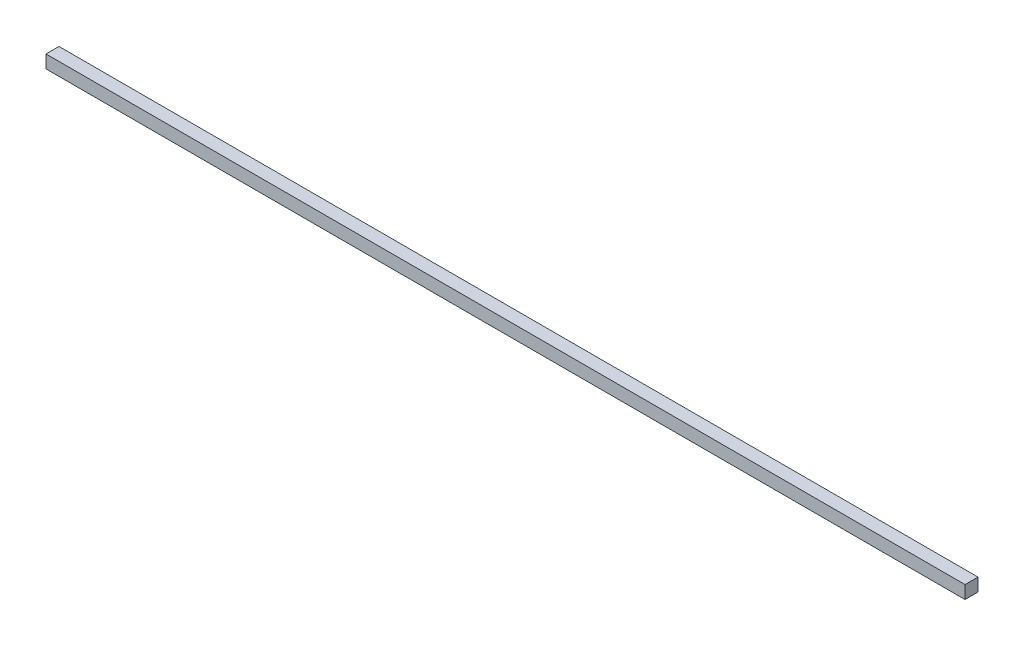
ISO-10303-21;
HEADER;
FILE_DESCRIPTION(('STEP AP214'),'2;1');
FILE_NAME('part.step','',(''),(''),'','','');
FILE_SCHEMA(('AUTOMOTIVE_DESIGN { 1 0 10303 214 1 1 1 1 }'));
ENDSEC;
DATA;
#1=APPLICATION_CONTEXT('core data for automotive mechanical design processes');
#2=APPLICATION_PROTOCOL_DEFINITION('international standard','automotive_design',2000,#1);
#3=PRODUCT_CONTEXT('',#1,'mechanical');
#4=PRODUCT('Part','Part','',(#3));
#5=PRODUCT_RELATED_PRODUCT_CATEGORY('part','',(#4));
#6=PRODUCT_DEFINITION_FORMATION('','',#4);
#7=PRODUCT_DEFINITION_CONTEXT('part definition',#1,'design');
#8=PRODUCT_DEFINITION('design','',#6,#7);
#9=PRODUCT_DEFINITION_SHAPE('','',#8);
#10=(LENGTH_UNIT() NAMED_UNIT(*) SI_UNIT(.MILLI.,.METRE.));
#11=(NAMED_UNIT(*) PLANE_ANGLE_UNIT() SI_UNIT($,.RADIAN.));
#12=(NAMED_UNIT(*) SI_UNIT($,.STERADIAN.) SOLID_ANGLE_UNIT());
#13=UNCERTAINTY_MEASURE_WITH_UNIT(LENGTH_MEASURE(1.E-05),#10,'distance_accuracy_value','');
#14=(GEOMETRIC_REPRESENTATION_CONTEXT(3) GLOBAL_UNCERTAINTY_ASSIGNED_CONTEXT((#13)) GLOBAL_UNIT_ASSIGNED_CONTEXT((#10,
#11,#12)) REPRESENTATION_CONTEXT('',''));
#15=CARTESIAN_POINT('',(0.,0.,0.));
#16=DIRECTION('',(0.,0.,1.));
#17=DIRECTION('',(1.,0.,0.));
#18=AXIS2_PLACEMENT_3D('',#15,#16,#17);
#19=CARTESIAN_POINT('',(0.,0.,3.175));
#20=DIRECTION('',(1.,0.,0.));
#21=DIRECTION('',(0.,0.,-1.));
#22=AXIS2_PLACEMENT_3D('',#19,#20,#21);
#23=PLANE('',#22);
#24=DIRECTION('',(0.,-1.,0.));
#25=VECTOR('',#24,1.);
#26=CARTESIAN_POINT('',(0.,0.,0.));
#27=LINE('',#26,#25);
#28=CARTESIAN_POINT('',(0.,3.175,0.));
#29=VERTEX_POINT('',#28);
#30=CARTESIAN_POINT('',(0.,0.,0.));
#31=VERTEX_POINT('',#30);
#32=EDGE_CURVE('E90',#29,#31,#27,.T.);
#33=ORIENTED_EDGE('',*,*,#32,.T.);
#34=DIRECTION('',(0.,0.,-1.));
#35=VECTOR('',#34,1.);
#36=CARTESIAN_POINT('',(0.,0.,3.175));
#37=LINE('',#36,#35);
#38=CARTESIAN_POINT('',(0.,0.,3.175));
#39=VERTEX_POINT('',#38);
#40=EDGE_CURVE('E11',#39,#31,#37,.T.);
#41=ORIENTED_EDGE('',*,*,#40,.F.);
#42=DIRECTION('',(0.,-1.,0.));
#43=VECTOR('',#42,1.);
#44=CARTESIAN_POINT('',(0.,0.,3.175));
#45=LINE('',#44,#43);
#46=CARTESIAN_POINT('',(0.,3.175,3.175));
#47=VERTEX_POINT('',#46);
#48=EDGE_CURVE('E84',#47,#39,#45,.T.);
#49=ORIENTED_EDGE('',*,*,#48,.F.);
#50=DIRECTION('',(0.,0.,-1.));
#51=VECTOR('',#50,1.);
#52=CARTESIAN_POINT('',(0.,3.175,3.175));
#53=LINE('',#52,#51);
#54=EDGE_CURVE('E45',#47,#29,#53,.T.);
#55=ORIENTED_EDGE('',*,*,#54,.T.);
#56=EDGE_LOOP('',(#33,#41,#49,#55));
#57=FACE_BOUND('',#56,.T.);
#58=ADVANCED_FACE('F37',(#57),#23,.F.);
#59=CARTESIAN_POINT('',(0.,0.,3.175));
#60=DIRECTION('',(0.,1.,0.));
#61=DIRECTION('',(0.,0.,1.));
#62=AXIS2_PLACEMENT_3D('',#59,#60,#61);
#63=PLANE('',#62);
#64=DIRECTION('',(1.,0.,0.));
#65=VECTOR('',#64,1.);
#66=CARTESIAN_POINT('',(0.,0.,0.));
#67=LINE('',#66,#65);
#68=CARTESIAN_POINT('',(224.79,0.,0.));
#69=VERTEX_POINT('',#68);
#70=EDGE_CURVE('E85',#31,#69,#67,.T.);
#71=ORIENTED_EDGE('',*,*,#70,.T.);
#72=DIRECTION('',(0.,0.,1.));
#73=VECTOR('',#72,1.);
#74=CARTESIAN_POINT('',(224.79,0.,0.));
#75=LINE('',#74,#73);
#76=CARTESIAN_POINT('',(224.79,0.,3.175));
#77=VERTEX_POINT('',#76);
#78=EDGE_CURVE('E52',#69,#77,#75,.T.);
#79=ORIENTED_EDGE('',*,*,#78,.T.);
#80=DIRECTION('',(1.,0.,0.));
#81=VECTOR('',#80,1.);
#82=CARTESIAN_POINT('',(0.,0.,3.175));
#83=LINE('',#82,#81);
#84=EDGE_CURVE('E103',#39,#77,#83,.T.);
#85=ORIENTED_EDGE('',*,*,#84,.F.);
#86=ORIENTED_EDGE('',*,*,#40,.T.);
#87=EDGE_LOOP('',(#71,#79,#85,#86));
#88=FACE_BOUND('',#87,.T.);
#89=ADVANCED_FACE('F117',(#88),#63,.F.);
#90=CARTESIAN_POINT('',(0.,3.175,3.175));
#91=DIRECTION('',(0.,-1.,0.));
#92=DIRECTION('',(1.,0.,0.));
#93=AXIS2_PLACEMENT_3D('',#90,#91,#92);
#94=PLANE('',#93);
#95=DIRECTION('',(-1.,0.,0.));
#96=VECTOR('',#95,1.);
#97=CARTESIAN_POINT('',(0.,3.175,3.175));
#98=LINE('',#97,#96);
#99=CARTESIAN_POINT('',(224.79,3.175,3.175));
#100=VERTEX_POINT('',#99);
#101=EDGE_CURVE('E61',#100,#47,#98,.T.);
#102=ORIENTED_EDGE('',*,*,#101,.F.);
#103=DIRECTION('',(0.,0.,1.));
#104=VECTOR('',#103,1.);
#105=CARTESIAN_POINT('',(224.79,3.175,0.));
#106=LINE('',#105,#104);
#107=CARTESIAN_POINT('',(224.79,3.175,0.));
#108=VERTEX_POINT('',#107);
#109=EDGE_CURVE('E80',#108,#100,#106,.T.);
#110=ORIENTED_EDGE('',*,*,#109,.F.);
#111=DIRECTION('',(-1.,0.,0.));
#112=VECTOR('',#111,1.);
#113=CARTESIAN_POINT('',(0.,3.175,0.));
#114=LINE('',#113,#112);
#115=EDGE_CURVE('E75',#108,#29,#114,.T.);
#116=ORIENTED_EDGE('',*,*,#115,.T.);
#117=ORIENTED_EDGE('',*,*,#54,.F.);
#118=EDGE_LOOP('',(#102,#110,#116,#117));
#119=FACE_BOUND('',#118,.T.);
#120=ADVANCED_FACE('F77',(#119),#94,.F.);
#121=CARTESIAN_POINT('',(0.,0.,3.175));
#122=DIRECTION('',(0.,0.,-1.));
#123=DIRECTION('',(-1.,0.,0.));
#124=AXIS2_PLACEMENT_3D('',#121,#122,#123);
#125=PLANE('',#124);
#126=ORIENTED_EDGE('',*,*,#84,.T.);
#127=DIRECTION('',(0.,-1.,0.));
#128=VECTOR('',#127,1.);
#129=CARTESIAN_POINT('',(224.79,0.,3.175));
#130=LINE('',#129,#128);
#131=EDGE_CURVE('E112',#100,#77,#130,.T.);
#132=ORIENTED_EDGE('',*,*,#131,.F.);
#133=ORIENTED_EDGE('',*,*,#101,.T.);
#134=ORIENTED_EDGE('',*,*,#48,.T.);
#135=EDGE_LOOP('',(#126,#132,#133,#134));
#136=FACE_BOUND('',#135,.T.);
#137=ADVANCED_FACE('F119',(#136),#125,.F.);
#138=CARTESIAN_POINT('',(0.,0.,0.));
#139=DIRECTION('',(0.,0.,-1.));
#140=DIRECTION('',(-1.,0.,0.));
#141=AXIS2_PLACEMENT_3D('',#138,#139,#140);
#142=PLANE('',#141);
#143=DIRECTION('',(0.,-1.,0.));
#144=VECTOR('',#143,1.);
#145=CARTESIAN_POINT('',(224.79,0.,0.));
#146=LINE('',#145,#144);
#147=EDGE_CURVE('E110',#108,#69,#146,.T.);
#148=ORIENTED_EDGE('',*,*,#147,.T.);
#149=ORIENTED_EDGE('',*,*,#70,.F.);
#150=ORIENTED_EDGE('',*,*,#32,.F.);
#151=ORIENTED_EDGE('',*,*,#115,.F.);
#152=EDGE_LOOP('',(#148,#149,#150,#151));
#153=FACE_BOUND('',#152,.T.);
#154=ADVANCED_FACE('F92',(#153),#142,.T.);
#155=CARTESIAN_POINT('',(224.79,0.,0.));
#156=DIRECTION('',(-1.,0.,0.));
#157=DIRECTION('',(0.,0.,1.));
#158=AXIS2_PLACEMENT_3D('',#155,#156,#157);
#159=PLANE('',#158);
#160=ORIENTED_EDGE('',*,*,#131,.T.);
#161=ORIENTED_EDGE('',*,*,#78,.F.);
#162=ORIENTED_EDGE('',*,*,#147,.F.);
#163=ORIENTED_EDGE('',*,*,#109,.T.);
#164=EDGE_LOOP('',(#160,#161,#162,#163));
#165=FACE_BOUND('',#164,.T.);
#166=ADVANCED_FACE('F126',(#165),#159,.F.);
#167=CLOSED_SHELL('',(#58,#89,#120,#137,#154,#166));
#168=MANIFOLD_SOLID_BREP('B2',#167);
#169=ADVANCED_BREP_SHAPE_REPRESENTATION('',(#18,#168),#14);
#170=SHAPE_DEFINITION_REPRESENTATION(#9,#169);
ENDSEC;
END-ISO-10303-21;
